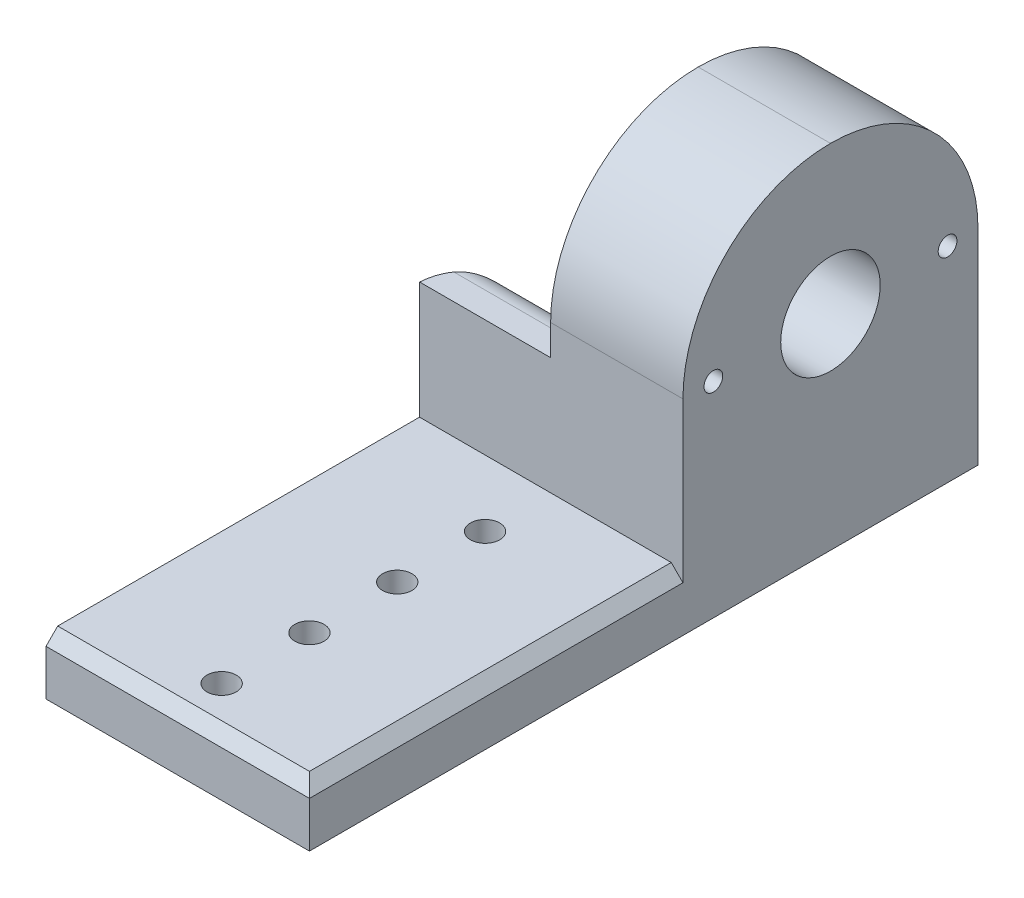
ISO-10303-21;
HEADER;
FILE_DESCRIPTION(('STEP AP214'),'2;1');
FILE_NAME('part.step','',(''),(''),'','','');
FILE_SCHEMA(('AUTOMOTIVE_DESIGN { 1 0 10303 214 1 1 1 1 }'));
ENDSEC;
DATA;
#1=APPLICATION_CONTEXT('core data for automotive mechanical design processes');
#2=APPLICATION_PROTOCOL_DEFINITION('international standard','automotive_design',2000,#1);
#3=PRODUCT_CONTEXT('',#1,'mechanical');
#4=PRODUCT('Part','Part','',(#3));
#5=PRODUCT_RELATED_PRODUCT_CATEGORY('part','',(#4));
#6=PRODUCT_DEFINITION_FORMATION('','',#4);
#7=PRODUCT_DEFINITION_CONTEXT('part definition',#1,'design');
#8=PRODUCT_DEFINITION('design','',#6,#7);
#9=PRODUCT_DEFINITION_SHAPE('','',#8);
#10=(LENGTH_UNIT() NAMED_UNIT(*) SI_UNIT(.MILLI.,.METRE.));
#11=(NAMED_UNIT(*) PLANE_ANGLE_UNIT() SI_UNIT($,.RADIAN.));
#12=(NAMED_UNIT(*) SI_UNIT($,.STERADIAN.) SOLID_ANGLE_UNIT());
#13=UNCERTAINTY_MEASURE_WITH_UNIT(LENGTH_MEASURE(1.E-05),#10,'distance_accuracy_value','');
#14=(GEOMETRIC_REPRESENTATION_CONTEXT(3) GLOBAL_UNCERTAINTY_ASSIGNED_CONTEXT((#13)) GLOBAL_UNIT_ASSIGNED_CONTEXT((#10,
#11,#12)) REPRESENTATION_CONTEXT('',''));
#15=CARTESIAN_POINT('',(0.,0.,0.));
#16=DIRECTION('',(0.,0.,1.));
#17=DIRECTION('',(1.,0.,0.));
#18=AXIS2_PLACEMENT_3D('',#15,#16,#17);
#19=CARTESIAN_POINT('',(28.448,76.454,-81.026));
#20=DIRECTION('',(-1.,0.,0.));
#21=DIRECTION('',(0.,0.,1.));
#22=AXIS2_PLACEMENT_3D('',#19,#20,#21);
#23=PLANE('',#22);
#24=CARTESIAN_POINT('',(28.448,44.45,-87.63));
#25=DIRECTION('',(-1.,0.,0.));
#26=DIRECTION('',(0.,0.,1.));
#27=AXIS2_PLACEMENT_3D('',#24,#25,#26);
#28=CIRCLE('',#27,2.03199999999999);
#29=CARTESIAN_POINT('',(28.448,44.45,-85.598));
#30=VERTEX_POINT('',#29);
#31=EDGE_CURVE('E195',#30,#30,#28,.T.);
#32=ORIENTED_EDGE('',*,*,#31,.F.);
#33=EDGE_LOOP('',(#32));
#34=FACE_BOUND('',#33,.T.);
#35=CARTESIAN_POINT('',(28.448,44.45,-138.43));
#36=DIRECTION('',(-1.,0.,0.));
#37=DIRECTION('',(0.,0.,1.));
#38=AXIS2_PLACEMENT_3D('',#35,#36,#37);
#39=CIRCLE('',#38,2.03200000000001);
#40=CARTESIAN_POINT('',(28.448,44.45,-136.398));
#41=VERTEX_POINT('',#40);
#42=EDGE_CURVE('E201',#41,#41,#39,.T.);
#43=ORIENTED_EDGE('',*,*,#42,.F.);
#44=EDGE_LOOP('',(#43));
#45=FACE_BOUND('',#44,.T.);
#46=CARTESIAN_POINT('',(28.448,44.45,-113.03));
#47=DIRECTION('',(-1.,0.,0.));
#48=DIRECTION('',(0.,0.,1.));
#49=AXIS2_PLACEMENT_3D('',#46,#47,#48);
#50=CIRCLE('',#49,10.795);
#51=CARTESIAN_POINT('',(28.448,44.45,-102.235));
#52=VERTEX_POINT('',#51);
#53=EDGE_CURVE('E207',#52,#52,#50,.T.);
#54=ORIENTED_EDGE('',*,*,#53,.F.);
#55=EDGE_LOOP('',(#54));
#56=FACE_BOUND('',#55,.T.);
#57=DIRECTION('',(0.,-0.707106781186549,-0.707106781186546));
#58=VECTOR('',#57,1.);
#59=CARTESIAN_POINT('',(28.448,13.462,-113.637411412341));
#60=LINE('',#59,#58);
#61=CARTESIAN_POINT('',(28.448,35.9861280605346,-91.1132833518065));
#62=VERTEX_POINT('',#61);
#63=CARTESIAN_POINT('',(28.448,13.462,-113.637411412341));
#64=VERTEX_POINT('',#63);
#65=EDGE_CURVE('E311',#62,#64,#60,.T.);
#66=ORIENTED_EDGE('',*,*,#65,.F.);
#67=CARTESIAN_POINT('',(28.448,31.496,-86.6231552912719));
#68=DIRECTION('',(-1.,0.,0.));
#69=DIRECTION('',(0.,0.,1.));
#70=AXIS2_PLACEMENT_3D('',#67,#68,#69);
#71=CIRCLE('',#70,6.35);
#72=CARTESIAN_POINT('',(28.448,37.846,-86.6231552912719));
#73=VERTEX_POINT('',#72);
#74=EDGE_CURVE('E42',#62,#73,#71,.F.);
#75=ORIENTED_EDGE('',*,*,#74,.T.);
#76=DIRECTION('',(0.,0.,-1.));
#77=VECTOR('',#76,1.);
#78=CARTESIAN_POINT('',(28.448,37.846,-81.026));
#79=LINE('',#78,#77);
#80=CARTESIAN_POINT('',(28.448,37.846,-81.026));
#81=VERTEX_POINT('',#80);
#82=EDGE_CURVE('E326',#81,#73,#79,.T.);
#83=ORIENTED_EDGE('',*,*,#82,.F.);
#84=DIRECTION('',(0.,-1.,0.));
#85=VECTOR('',#84,1.);
#86=CARTESIAN_POINT('',(28.448,76.454,-81.026));
#87=LINE('',#86,#85);
#88=CARTESIAN_POINT('',(28.448,44.45,-81.026));
#89=VERTEX_POINT('',#88);
#90=EDGE_CURVE('E218',#89,#81,#87,.T.);
#91=ORIENTED_EDGE('',*,*,#90,.F.);
#92=CARTESIAN_POINT('',(28.448,44.45,-113.03));
#93=DIRECTION('',(-1.,0.,0.));
#94=DIRECTION('',(0.,0.,1.));
#95=AXIS2_PLACEMENT_3D('',#92,#93,#94);
#96=CIRCLE('',#95,32.004);
#97=CARTESIAN_POINT('',(28.448,76.454,-113.03));
#98=VERTEX_POINT('',#97);
#99=EDGE_CURVE('E261',#89,#98,#96,.T.);
#100=ORIENTED_EDGE('',*,*,#99,.T.);
#101=CARTESIAN_POINT('',(28.448,44.45,-113.03));
#102=DIRECTION('',(-1.,0.,0.));
#103=DIRECTION('',(0.,0.,1.));
#104=AXIS2_PLACEMENT_3D('',#101,#102,#103);
#105=CIRCLE('',#104,32.004);
#106=CARTESIAN_POINT('',(28.448,44.45,-145.034));
#107=VERTEX_POINT('',#106);
#108=EDGE_CURVE('E263',#98,#107,#105,.T.);
#109=ORIENTED_EDGE('',*,*,#108,.T.);
#110=DIRECTION('',(0.,-1.,0.));
#111=VECTOR('',#110,1.);
#112=CARTESIAN_POINT('',(28.448,76.454,-145.034));
#113=LINE('',#112,#111);
#114=CARTESIAN_POINT('',(28.448,37.846,-145.034));
#115=VERTEX_POINT('',#114);
#116=EDGE_CURVE('E214',#107,#115,#113,.T.);
#117=ORIENTED_EDGE('',*,*,#116,.T.);
#118=DIRECTION('',(0.,0.,-1.));
#119=VECTOR('',#118,1.);
#120=CARTESIAN_POINT('',(28.448,37.846,-138.021411412341));
#121=LINE('',#120,#119);
#122=CARTESIAN_POINT('',(28.448,37.846,-140.65166753341));
#123=VERTEX_POINT('',#122);
#124=EDGE_CURVE('E322',#123,#115,#121,.T.);
#125=ORIENTED_EDGE('',*,*,#124,.F.);
#126=CARTESIAN_POINT('',(28.448,31.496,-140.65166753341));
#127=DIRECTION('',(-1.,0.,0.));
#128=DIRECTION('',(0.,0.,1.));
#129=AXIS2_PLACEMENT_3D('',#126,#127,#128);
#130=CIRCLE('',#129,6.35);
#131=CARTESIAN_POINT('',(28.448,35.9861280605346,-136.161539472876));
#132=VERTEX_POINT('',#131);
#133=EDGE_CURVE('E11',#123,#132,#130,.F.);
#134=ORIENTED_EDGE('',*,*,#133,.T.);
#135=DIRECTION('',(0.,0.707106781186544,-0.707106781186551));
#136=VECTOR('',#135,1.);
#137=CARTESIAN_POINT('',(28.448,13.462,-113.637411412341));
#138=LINE('',#137,#136);
#139=EDGE_CURVE('E315',#64,#132,#138,.T.);
#140=ORIENTED_EDGE('',*,*,#139,.F.);
#141=EDGE_LOOP('',(#66,#75,#83,#91,#100,#109,#117,#125,#134,#140));
#142=FACE_BOUND('',#141,.T.);
#143=ADVANCED_FACE('F33',(#34,#45,#56,#142),#23,.T.);
#144=CARTESIAN_POINT('',(0.,12.446,0.));
#145=DIRECTION('',(0.,-1.,0.));
#146=DIRECTION('',(0.,0.,-1.));
#147=AXIS2_PLACEMENT_3D('',#144,#145,#146);
#148=PLANE('',#147);
#149=CARTESIAN_POINT('',(28.575,12.446,-9.525));
#150=DIRECTION('',(0.,-1.,0.));
#151=DIRECTION('',(0.,0.,-1.));
#152=AXIS2_PLACEMENT_3D('',#149,#150,#151);
#153=CIRCLE('',#152,3.175);
#154=CARTESIAN_POINT('',(28.575,12.446,-12.7));
#155=VERTEX_POINT('',#154);
#156=EDGE_CURVE('E192',#155,#155,#153,.F.);
#157=ORIENTED_EDGE('',*,*,#156,.F.);
#158=EDGE_LOOP('',(#157));
#159=FACE_BOUND('',#158,.T.);
#160=CARTESIAN_POINT('',(28.575,12.446,-47.625));
#161=DIRECTION('',(0.,-1.,0.));
#162=DIRECTION('',(0.,0.,-1.));
#163=AXIS2_PLACEMENT_3D('',#160,#161,#162);
#164=CIRCLE('',#163,3.175);
#165=CARTESIAN_POINT('',(28.575,12.446,-50.8));
#166=VERTEX_POINT('',#165);
#167=EDGE_CURVE('E186',#166,#166,#164,.F.);
#168=ORIENTED_EDGE('',*,*,#167,.F.);
#169=EDGE_LOOP('',(#168));
#170=FACE_BOUND('',#169,.T.);
#171=CARTESIAN_POINT('',(28.575,12.446,-66.675));
#172=DIRECTION('',(0.,-1.,0.));
#173=DIRECTION('',(0.,0.,-1.));
#174=AXIS2_PLACEMENT_3D('',#171,#172,#173);
#175=CIRCLE('',#174,3.175);
#176=CARTESIAN_POINT('',(28.575,12.446,-69.85));
#177=VERTEX_POINT('',#176);
#178=EDGE_CURVE('E174',#177,#177,#175,.F.);
#179=ORIENTED_EDGE('',*,*,#178,.F.);
#180=EDGE_LOOP('',(#179));
#181=FACE_BOUND('',#180,.T.);
#182=CARTESIAN_POINT('',(28.575,12.446,-28.575));
#183=DIRECTION('',(0.,-1.,0.));
#184=DIRECTION('',(0.,0.,-1.));
#185=AXIS2_PLACEMENT_3D('',#182,#183,#184);
#186=CIRCLE('',#185,3.175);
#187=CARTESIAN_POINT('',(28.575,12.446,-31.75));
#188=VERTEX_POINT('',#187);
#189=EDGE_CURVE('E189',#188,#188,#186,.F.);
#190=ORIENTED_EDGE('',*,*,#189,.F.);
#191=EDGE_LOOP('',(#190));
#192=FACE_BOUND('',#191,.T.);
#193=DIRECTION('',(-1.,0.,0.));
#194=VECTOR('',#193,1.);
#195=CARTESIAN_POINT('',(57.15,12.446,-81.026));
#196=LINE('',#195,#194);
#197=CARTESIAN_POINT('',(54.6099999999999,12.446,-81.026));
#198=VERTEX_POINT('',#197);
#199=CARTESIAN_POINT('',(0.,12.446,-81.026));
#200=VERTEX_POINT('',#199);
#201=EDGE_CURVE('E157',#198,#200,#196,.T.);
#202=ORIENTED_EDGE('',*,*,#201,.T.);
#203=DIRECTION('',(0.,0.,1.));
#204=VECTOR('',#203,1.);
#205=CARTESIAN_POINT('',(0.,12.446,-145.034));
#206=LINE('',#205,#204);
#207=CARTESIAN_POINT('',(0.,12.446,-2.54000000000008));
#208=VERTEX_POINT('',#207);
#209=EDGE_CURVE('E170',#200,#208,#206,.T.);
#210=ORIENTED_EDGE('',*,*,#209,.T.);
#211=DIRECTION('',(1.,0.,0.));
#212=VECTOR('',#211,1.);
#213=CARTESIAN_POINT('',(0.,12.446,-2.54000000000004));
#214=LINE('',#213,#212);
#215=CARTESIAN_POINT('',(54.61,12.446,-2.54000000000004));
#216=VERTEX_POINT('',#215);
#217=EDGE_CURVE('E272',#208,#216,#214,.T.);
#218=ORIENTED_EDGE('',*,*,#217,.T.);
#219=DIRECTION('',(0.,0.,-1.));
#220=VECTOR('',#219,1.);
#221=CARTESIAN_POINT('',(54.61,12.446,0.));
#222=LINE('',#221,#220);
#223=EDGE_CURVE('E173',#216,#198,#222,.T.);
#224=ORIENTED_EDGE('',*,*,#223,.T.);
#225=EDGE_LOOP('',(#202,#210,#218,#224));
#226=FACE_BOUND('',#225,.T.);
#227=ADVANCED_FACE('F168',(#159,#170,#181,#192,#226),#148,.F.);
#228=CARTESIAN_POINT('',(0.,25.4,0.));
#229=DIRECTION('',(1.,0.,0.));
#230=DIRECTION('',(0.,0.,-1.));
#231=AXIS2_PLACEMENT_3D('',#228,#229,#230);
#232=PLANE('',#231);
#233=DIRECTION('',(0.,-1.,0.));
#234=VECTOR('',#233,1.);
#235=CARTESIAN_POINT('',(0.,12.446,-81.026));
#236=LINE('',#235,#234);
#237=CARTESIAN_POINT('',(0.,37.0931552912719,-81.026));
#238=VERTEX_POINT('',#237);
#239=EDGE_CURVE('E152',#238,#200,#236,.T.);
#240=ORIENTED_EDGE('',*,*,#239,.F.);
#241=DIRECTION('',(0.,0.707106781186549,0.707106781186546));
#242=VECTOR('',#241,1.);
#243=CARTESIAN_POINT('',(0.,71.759577645636,-46.3595776456362));
#244=LINE('',#243,#242);
#245=CARTESIAN_POINT('',(0.,4.48174387893086,-113.637411412341));
#246=VERTEX_POINT('',#245);
#247=EDGE_CURVE('E293',#238,#246,#244,.F.);
#248=ORIENTED_EDGE('',*,*,#247,.T.);
#249=DIRECTION('',(0.,-0.707106781186544,0.707106781186551));
#250=VECTOR('',#249,1.);
#251=CARTESIAN_POINT('',(0.,-41.8778337667052,-67.2778337667044));
#252=LINE('',#251,#250);
#253=CARTESIAN_POINT('',(0.,35.8783324665896,-145.034));
#254=VERTEX_POINT('',#253);
#255=EDGE_CURVE('E291',#246,#254,#252,.F.);
#256=ORIENTED_EDGE('',*,*,#255,.T.);
#257=DIRECTION('',(0.,-1.,0.));
#258=VECTOR('',#257,1.);
#259=CARTESIAN_POINT('',(0.,25.4,-145.034));
#260=LINE('',#259,#258);
#261=CARTESIAN_POINT('',(0.,0.,-145.034));
#262=VERTEX_POINT('',#261);
#263=EDGE_CURVE('E246',#254,#262,#260,.T.);
#264=ORIENTED_EDGE('',*,*,#263,.T.);
#265=DIRECTION('',(0.,0.,1.));
#266=VECTOR('',#265,1.);
#267=CARTESIAN_POINT('',(0.,0.,0.));
#268=LINE('',#267,#266);
#269=CARTESIAN_POINT('',(0.,0.,0.));
#270=VERTEX_POINT('',#269);
#271=EDGE_CURVE('E234',#262,#270,#268,.T.);
#272=ORIENTED_EDGE('',*,*,#271,.T.);
#273=DIRECTION('',(0.,-1.,0.));
#274=VECTOR('',#273,1.);
#275=CARTESIAN_POINT('',(0.,25.4,0.));
#276=LINE('',#275,#274);
#277=CARTESIAN_POINT('',(0.,9.90599999999996,0.));
#278=VERTEX_POINT('',#277);
#279=EDGE_CURVE('E252',#278,#270,#276,.T.);
#280=ORIENTED_EDGE('',*,*,#279,.F.);
#281=DIRECTION('',(0.,-0.707106781186548,0.707106781186548));
#282=VECTOR('',#281,1.);
#283=CARTESIAN_POINT('',(0.,12.446,-2.54000000000004));
#284=LINE('',#283,#282);
#285=EDGE_CURVE('E179',#278,#208,#284,.F.);
#286=ORIENTED_EDGE('',*,*,#285,.T.);
#287=ORIENTED_EDGE('',*,*,#209,.F.);
#288=EDGE_LOOP('',(#240,#248,#256,#264,#272,#280,#286,#287));
#289=FACE_BOUND('',#288,.T.);
#290=ADVANCED_FACE('F176',(#289),#232,.F.);
#291=CARTESIAN_POINT('',(0.,25.4,0.));
#292=DIRECTION('',(0.,0.,-1.));
#293=DIRECTION('',(-1.,0.,0.));
#294=AXIS2_PLACEMENT_3D('',#291,#292,#293);
#295=PLANE('',#294);
#296=DIRECTION('',(0.,-1.,0.));
#297=VECTOR('',#296,1.);
#298=CARTESIAN_POINT('',(57.15,25.4,0.));
#299=LINE('',#298,#297);
#300=CARTESIAN_POINT('',(57.15,9.90599999999996,0.));
#301=VERTEX_POINT('',#300);
#302=CARTESIAN_POINT('',(57.15,0.,0.));
#303=VERTEX_POINT('',#302);
#304=EDGE_CURVE('E250',#301,#303,#299,.T.);
#305=ORIENTED_EDGE('',*,*,#304,.F.);
#306=DIRECTION('',(-1.,0.,0.));
#307=VECTOR('',#306,1.);
#308=CARTESIAN_POINT('',(0.,9.90599999999996,0.));
#309=LINE('',#308,#307);
#310=EDGE_CURVE('E274',#301,#278,#309,.T.);
#311=ORIENTED_EDGE('',*,*,#310,.T.);
#312=ORIENTED_EDGE('',*,*,#279,.T.);
#313=DIRECTION('',(1.,0.,0.));
#314=VECTOR('',#313,1.);
#315=CARTESIAN_POINT('',(0.,0.,0.));
#316=LINE('',#315,#314);
#317=EDGE_CURVE('E237',#270,#303,#316,.T.);
#318=ORIENTED_EDGE('',*,*,#317,.T.);
#319=EDGE_LOOP('',(#305,#311,#312,#318));
#320=FACE_BOUND('',#319,.T.);
#321=ADVANCED_FACE('F389',(#320),#295,.F.);
#322=CARTESIAN_POINT('',(57.15,25.4,0.));
#323=DIRECTION('',(-1.,0.,0.));
#324=DIRECTION('',(0.,0.,1.));
#325=AXIS2_PLACEMENT_3D('',#322,#323,#324);
#326=PLANE('',#325);
#327=CARTESIAN_POINT('',(57.15,44.45,-87.63));
#328=DIRECTION('',(-1.,0.,0.));
#329=DIRECTION('',(0.,0.,1.));
#330=AXIS2_PLACEMENT_3D('',#327,#328,#329);
#331=CIRCLE('',#330,2.03199999999999);
#332=CARTESIAN_POINT('',(57.15,44.45,-85.598));
#333=VERTEX_POINT('',#332);
#334=EDGE_CURVE('E198',#333,#333,#331,.T.);
#335=ORIENTED_EDGE('',*,*,#334,.T.);
#336=EDGE_LOOP('',(#335));
#337=FACE_BOUND('',#336,.T.);
#338=CARTESIAN_POINT('',(57.15,44.45,-138.43));
#339=DIRECTION('',(-1.,0.,0.));
#340=DIRECTION('',(0.,0.,1.));
#341=AXIS2_PLACEMENT_3D('',#338,#339,#340);
#342=CIRCLE('',#341,2.03200000000001);
#343=CARTESIAN_POINT('',(57.15,44.45,-136.398));
#344=VERTEX_POINT('',#343);
#345=EDGE_CURVE('E204',#344,#344,#342,.T.);
#346=ORIENTED_EDGE('',*,*,#345,.T.);
#347=EDGE_LOOP('',(#346));
#348=FACE_BOUND('',#347,.T.);
#349=CARTESIAN_POINT('',(57.15,44.45,-113.03));
#350=DIRECTION('',(-1.,0.,0.));
#351=DIRECTION('',(0.,0.,1.));
#352=AXIS2_PLACEMENT_3D('',#349,#350,#351);
#353=CIRCLE('',#352,10.795);
#354=CARTESIAN_POINT('',(57.15,44.45,-102.235));
#355=VERTEX_POINT('',#354);
#356=EDGE_CURVE('E210',#355,#355,#353,.T.);
#357=ORIENTED_EDGE('',*,*,#356,.T.);
#358=EDGE_LOOP('',(#357));
#359=FACE_BOUND('',#358,.T.);
#360=DIRECTION('',(0.,-1.,0.));
#361=VECTOR('',#360,1.);
#362=CARTESIAN_POINT('',(57.15,76.454,-81.026));
#363=LINE('',#362,#361);
#364=CARTESIAN_POINT('',(57.15,44.45,-81.026));
#365=VERTEX_POINT('',#364);
#366=CARTESIAN_POINT('',(57.15,9.90599999999996,-81.026));
#367=VERTEX_POINT('',#366);
#368=EDGE_CURVE('E221',#365,#367,#363,.T.);
#369=ORIENTED_EDGE('',*,*,#368,.T.);
#370=DIRECTION('',(0.,0.,1.));
#371=VECTOR('',#370,1.);
#372=CARTESIAN_POINT('',(57.15,9.90599999999996,0.));
#373=LINE('',#372,#371);
#374=EDGE_CURVE('E277',#367,#301,#373,.T.);
#375=ORIENTED_EDGE('',*,*,#374,.T.);
#376=ORIENTED_EDGE('',*,*,#304,.T.);
#377=DIRECTION('',(0.,0.,-1.));
#378=VECTOR('',#377,1.);
#379=CARTESIAN_POINT('',(57.15,0.,0.));
#380=LINE('',#379,#378);
#381=CARTESIAN_POINT('',(57.15,0.,-145.034));
#382=VERTEX_POINT('',#381);
#383=EDGE_CURVE('E240',#303,#382,#380,.T.);
#384=ORIENTED_EDGE('',*,*,#383,.T.);
#385=DIRECTION('',(0.,-1.,0.));
#386=VECTOR('',#385,1.);
#387=CARTESIAN_POINT('',(57.15,25.4,-145.034));
#388=LINE('',#387,#386);
#389=CARTESIAN_POINT('',(57.15,44.45,-145.034));
#390=VERTEX_POINT('',#389);
#391=EDGE_CURVE('E248',#390,#382,#388,.T.);
#392=ORIENTED_EDGE('',*,*,#391,.F.);
#393=CARTESIAN_POINT('',(57.15,44.45,-113.03));
#394=DIRECTION('',(-1.,0.,0.));
#395=DIRECTION('',(0.,0.,1.));
#396=AXIS2_PLACEMENT_3D('',#393,#394,#395);
#397=CIRCLE('',#396,32.004);
#398=CARTESIAN_POINT('',(57.15,76.454,-113.03));
#399=VERTEX_POINT('',#398);
#400=EDGE_CURVE('E259',#390,#399,#397,.F.);
#401=ORIENTED_EDGE('',*,*,#400,.T.);
#402=CARTESIAN_POINT('',(57.15,44.45,-113.03));
#403=DIRECTION('',(-1.,0.,0.));
#404=DIRECTION('',(0.,0.,1.));
#405=AXIS2_PLACEMENT_3D('',#402,#403,#404);
#406=CIRCLE('',#405,32.004);
#407=EDGE_CURVE('E257',#399,#365,#406,.F.);
#408=ORIENTED_EDGE('',*,*,#407,.T.);
#409=EDGE_LOOP('',(#369,#375,#376,#384,#392,#401,#408));
#410=FACE_BOUND('',#409,.T.);
#411=ADVANCED_FACE('F387',(#337,#348,#359,#410),#326,.F.);
#412=CARTESIAN_POINT('',(0.,25.4,-145.034));
#413=DIRECTION('',(0.,0.,1.));
#414=DIRECTION('',(1.,0.,0.));
#415=AXIS2_PLACEMENT_3D('',#412,#413,#414);
#416=PLANE('',#415);
#417=ORIENTED_EDGE('',*,*,#263,.F.);
#418=CARTESIAN_POINT('',(6.34999999999998,35.8783324665896,-145.034));
#419=DIRECTION('',(0.,0.,1.));
#420=DIRECTION('',(0.,-1.,0.));
#421=AXIS2_PLACEMENT_3D('',#418,#419,#420);
#422=ELLIPSE('',#421,8.9802561210691,6.35);
#423=CARTESIAN_POINT('',(0.154304539522504,37.846,-145.034));
#424=VERTEX_POINT('',#423);
#425=EDGE_CURVE('E299',#254,#424,#422,.F.);
#426=ORIENTED_EDGE('',*,*,#425,.T.);
#427=DIRECTION('',(1.,0.,0.));
#428=VECTOR('',#427,1.);
#429=CARTESIAN_POINT('',(-68.8635176563033,37.846,-145.034));
#430=LINE('',#429,#428);
#431=EDGE_CURVE('E330',#424,#115,#430,.T.);
#432=ORIENTED_EDGE('',*,*,#431,.T.);
#433=ORIENTED_EDGE('',*,*,#116,.F.);
#434=DIRECTION('',(1.,0.,0.));
#435=VECTOR('',#434,1.);
#436=CARTESIAN_POINT('',(57.15,44.45,-145.034));
#437=LINE('',#436,#435);
#438=EDGE_CURVE('E254',#107,#390,#437,.T.);
#439=ORIENTED_EDGE('',*,*,#438,.T.);
#440=ORIENTED_EDGE('',*,*,#391,.T.);
#441=DIRECTION('',(-1.,0.,0.));
#442=VECTOR('',#441,1.);
#443=CARTESIAN_POINT('',(0.,0.,-145.034));
#444=LINE('',#443,#442);
#445=EDGE_CURVE('E243',#382,#262,#444,.T.);
#446=ORIENTED_EDGE('',*,*,#445,.T.);
#447=EDGE_LOOP('',(#417,#426,#432,#433,#439,#440,#446));
#448=FACE_BOUND('',#447,.T.);
#449=ADVANCED_FACE('F358',(#448),#416,.F.);
#450=CARTESIAN_POINT('',(0.,0.,0.));
#451=DIRECTION('',(0.,-1.,0.));
#452=DIRECTION('',(0.,0.,-1.));
#453=AXIS2_PLACEMENT_3D('',#450,#451,#452);
#454=PLANE('',#453);
#455=ORIENTED_EDGE('',*,*,#271,.F.);
#456=ORIENTED_EDGE('',*,*,#445,.F.);
#457=ORIENTED_EDGE('',*,*,#383,.F.);
#458=ORIENTED_EDGE('',*,*,#317,.F.);
#459=EDGE_LOOP('',(#455,#456,#457,#458));
#460=FACE_BOUND('',#459,.T.);
#461=CARTESIAN_POINT('',(28.575,0.,-66.675));
#462=DIRECTION('',(0.,-1.,0.));
#463=DIRECTION('',(0.,0.,-1.));
#464=AXIS2_PLACEMENT_3D('',#461,#462,#463);
#465=CIRCLE('',#464,3.175);
#466=CARTESIAN_POINT('',(28.575,0.,-69.85));
#467=VERTEX_POINT('',#466);
#468=EDGE_CURVE('E217',#467,#467,#465,.T.);
#469=ORIENTED_EDGE('',*,*,#468,.F.);
#470=EDGE_LOOP('',(#469));
#471=FACE_BOUND('',#470,.T.);
#472=CARTESIAN_POINT('',(28.575,0.,-47.625));
#473=DIRECTION('',(0.,-1.,0.));
#474=DIRECTION('',(0.,0.,-1.));
#475=AXIS2_PLACEMENT_3D('',#472,#473,#474);
#476=CIRCLE('',#475,3.175);
#477=CARTESIAN_POINT('',(28.575,0.,-50.8));
#478=VERTEX_POINT('',#477);
#479=EDGE_CURVE('E225',#478,#478,#476,.T.);
#480=ORIENTED_EDGE('',*,*,#479,.F.);
#481=EDGE_LOOP('',(#480));
#482=FACE_BOUND('',#481,.T.);
#483=CARTESIAN_POINT('',(28.575,0.,-28.575));
#484=DIRECTION('',(0.,-1.,0.));
#485=DIRECTION('',(0.,0.,-1.));
#486=AXIS2_PLACEMENT_3D('',#483,#484,#485);
#487=CIRCLE('',#486,3.175);
#488=CARTESIAN_POINT('',(28.575,0.,-31.75));
#489=VERTEX_POINT('',#488);
#490=EDGE_CURVE('E228',#489,#489,#487,.T.);
#491=ORIENTED_EDGE('',*,*,#490,.F.);
#492=EDGE_LOOP('',(#491));
#493=FACE_BOUND('',#492,.T.);
#494=CARTESIAN_POINT('',(28.575,0.,-9.525));
#495=DIRECTION('',(0.,-1.,0.));
#496=DIRECTION('',(0.,0.,-1.));
#497=AXIS2_PLACEMENT_3D('',#494,#495,#496);
#498=CIRCLE('',#497,3.175);
#499=CARTESIAN_POINT('',(28.575,0.,-12.7));
#500=VERTEX_POINT('',#499);
#501=EDGE_CURVE('E231',#500,#500,#498,.T.);
#502=ORIENTED_EDGE('',*,*,#501,.F.);
#503=EDGE_LOOP('',(#502));
#504=FACE_BOUND('',#503,.T.);
#505=ADVANCED_FACE('F365',(#460,#471,#482,#493,#504),#454,.T.);
#506=CARTESIAN_POINT('',(28.575,25.4,-9.525));
#507=DIRECTION('',(0.,-1.,0.));
#508=DIRECTION('',(0.,0.,-1.));
#509=AXIS2_PLACEMENT_3D('',#506,#507,#508);
#510=CYLINDRICAL_SURFACE('',#509,3.175);
#511=ORIENTED_EDGE('',*,*,#156,.T.);
#512=EDGE_LOOP('',(#511));
#513=FACE_BOUND('',#512,.T.);
#514=ORIENTED_EDGE('',*,*,#501,.T.);
#515=EDGE_LOOP('',(#514));
#516=FACE_BOUND('',#515,.T.);
#517=ADVANCED_FACE('F426',(#513,#516),#510,.F.);
#518=CARTESIAN_POINT('',(28.575,25.4,-28.575));
#519=DIRECTION('',(0.,-1.,0.));
#520=DIRECTION('',(0.,0.,-1.));
#521=AXIS2_PLACEMENT_3D('',#518,#519,#520);
#522=CYLINDRICAL_SURFACE('',#521,3.175);
#523=ORIENTED_EDGE('',*,*,#189,.T.);
#524=EDGE_LOOP('',(#523));
#525=FACE_BOUND('',#524,.T.);
#526=ORIENTED_EDGE('',*,*,#490,.T.);
#527=EDGE_LOOP('',(#526));
#528=FACE_BOUND('',#527,.T.);
#529=ADVANCED_FACE('F422',(#525,#528),#522,.F.);
#530=CARTESIAN_POINT('',(28.575,25.4,-47.625));
#531=DIRECTION('',(0.,-1.,0.));
#532=DIRECTION('',(0.,0.,-1.));
#533=AXIS2_PLACEMENT_3D('',#530,#531,#532);
#534=CYLINDRICAL_SURFACE('',#533,3.175);
#535=ORIENTED_EDGE('',*,*,#167,.T.);
#536=EDGE_LOOP('',(#535));
#537=FACE_BOUND('',#536,.T.);
#538=ORIENTED_EDGE('',*,*,#479,.T.);
#539=EDGE_LOOP('',(#538));
#540=FACE_BOUND('',#539,.T.);
#541=ADVANCED_FACE('F418',(#537,#540),#534,.F.);
#542=CARTESIAN_POINT('',(28.575,25.4,-66.675));
#543=DIRECTION('',(0.,-1.,0.));
#544=DIRECTION('',(0.,0.,-1.));
#545=AXIS2_PLACEMENT_3D('',#542,#543,#544);
#546=CYLINDRICAL_SURFACE('',#545,3.175);
#547=ORIENTED_EDGE('',*,*,#178,.T.);
#548=EDGE_LOOP('',(#547));
#549=FACE_BOUND('',#548,.T.);
#550=ORIENTED_EDGE('',*,*,#468,.T.);
#551=EDGE_LOOP('',(#550));
#552=FACE_BOUND('',#551,.T.);
#553=ADVANCED_FACE('F415',(#549,#552),#546,.F.);
#554=CARTESIAN_POINT('',(57.15,76.454,-81.026));
#555=DIRECTION('',(0.,0.,1.));
#556=DIRECTION('',(1.,0.,0.));
#557=AXIS2_PLACEMENT_3D('',#554,#555,#556);
#558=PLANE('',#557);
#559=DIRECTION('',(1.,0.,0.));
#560=VECTOR('',#559,1.);
#561=CARTESIAN_POINT('',(-68.8635176563033,37.846,-81.026));
#562=LINE('',#561,#560);
#563=CARTESIAN_POINT('',(0.0223533266884846,37.846,-81.026));
#564=VERTEX_POINT('',#563);
#565=EDGE_CURVE('E329',#564,#81,#562,.T.);
#566=ORIENTED_EDGE('',*,*,#565,.F.);
#567=CARTESIAN_POINT('',(6.34999999999999,37.0931552912719,-81.026));
#568=DIRECTION('',(0.,0.,1.));
#569=DIRECTION('',(0.,1.,0.));
#570=AXIS2_PLACEMENT_3D('',#567,#568,#569);
#571=ELLIPSE('',#570,8.98025612106917,6.35);
#572=EDGE_CURVE('E160',#564,#238,#571,.T.);
#573=ORIENTED_EDGE('',*,*,#572,.T.);
#574=ORIENTED_EDGE('',*,*,#239,.T.);
#575=ORIENTED_EDGE('',*,*,#201,.F.);
#576=DIRECTION('',(-0.707106781186548,0.707106781186548,0.));
#577=VECTOR('',#576,1.);
#578=CARTESIAN_POINT('',(54.6099999999999,12.446,-81.026));
#579=LINE('',#578,#577);
#580=EDGE_CURVE('E279',#198,#367,#579,.F.);
#581=ORIENTED_EDGE('',*,*,#580,.T.);
#582=ORIENTED_EDGE('',*,*,#368,.F.);
#583=DIRECTION('',(-1.,0.,0.));
#584=VECTOR('',#583,1.);
#585=CARTESIAN_POINT('',(57.15,44.45,-81.026));
#586=LINE('',#585,#584);
#587=EDGE_CURVE('E265',#365,#89,#586,.T.);
#588=ORIENTED_EDGE('',*,*,#587,.T.);
#589=ORIENTED_EDGE('',*,*,#90,.T.);
#590=EDGE_LOOP('',(#566,#573,#574,#575,#581,#582,#588,#589));
#591=FACE_BOUND('',#590,.T.);
#592=ADVANCED_FACE('F155',(#591),#558,.T.);
#593=CARTESIAN_POINT('',(57.15,44.45,-113.03));
#594=DIRECTION('',(-1.,0.,0.));
#595=DIRECTION('',(0.,0.,1.));
#596=AXIS2_PLACEMENT_3D('',#593,#594,#595);
#597=CYLINDRICAL_SURFACE('',#596,32.004);
#598=DIRECTION('',(-1.,0.,0.));
#599=VECTOR('',#598,1.);
#600=CARTESIAN_POINT('',(0.,76.454,-113.03));
#601=LINE('',#600,#599);
#602=EDGE_CURVE('E213',#98,#399,#601,.F.);
#603=ORIENTED_EDGE('',*,*,#602,.F.);
#604=ORIENTED_EDGE('',*,*,#99,.F.);
#605=ORIENTED_EDGE('',*,*,#587,.F.);
#606=ORIENTED_EDGE('',*,*,#407,.F.);
#607=EDGE_LOOP('',(#603,#604,#605,#606));
#608=FACE_BOUND('',#607,.T.);
#609=ADVANCED_FACE('F382',(#608),#597,.T.);
#610=CARTESIAN_POINT('',(0.,44.45,-113.03));
#611=DIRECTION('',(-1.,0.,0.));
#612=DIRECTION('',(0.,0.,1.));
#613=AXIS2_PLACEMENT_3D('',#610,#611,#612);
#614=CYLINDRICAL_SURFACE('',#613,32.004);
#615=ORIENTED_EDGE('',*,*,#108,.F.);
#616=ORIENTED_EDGE('',*,*,#602,.T.);
#617=ORIENTED_EDGE('',*,*,#400,.F.);
#618=ORIENTED_EDGE('',*,*,#438,.F.);
#619=EDGE_LOOP('',(#615,#616,#617,#618));
#620=FACE_BOUND('',#619,.T.);
#621=ADVANCED_FACE('F386',(#620),#614,.T.);
#622=CARTESIAN_POINT('',(104.902,44.45,-113.03));
#623=DIRECTION('',(-1.,0.,0.));
#624=DIRECTION('',(0.,0.,1.));
#625=AXIS2_PLACEMENT_3D('',#622,#623,#624);
#626=CYLINDRICAL_SURFACE('',#625,10.795);
#627=ORIENTED_EDGE('',*,*,#53,.T.);
#628=EDGE_LOOP('',(#627));
#629=FACE_BOUND('',#628,.T.);
#630=ORIENTED_EDGE('',*,*,#356,.F.);
#631=EDGE_LOOP('',(#630));
#632=FACE_BOUND('',#631,.T.);
#633=ADVANCED_FACE('F411',(#629,#632),#626,.F.);
#634=CARTESIAN_POINT('',(104.902,44.45,-138.43));
#635=DIRECTION('',(-1.,0.,0.));
#636=DIRECTION('',(0.,0.,1.));
#637=AXIS2_PLACEMENT_3D('',#634,#635,#636);
#638=CYLINDRICAL_SURFACE('',#637,2.03200000000001);
#639=ORIENTED_EDGE('',*,*,#42,.T.);
#640=EDGE_LOOP('',(#639));
#641=FACE_BOUND('',#640,.T.);
#642=ORIENTED_EDGE('',*,*,#345,.F.);
#643=EDGE_LOOP('',(#642));
#644=FACE_BOUND('',#643,.T.);
#645=ADVANCED_FACE('F483',(#641,#644),#638,.F.);
#646=CARTESIAN_POINT('',(104.902,44.45,-87.63));
#647=DIRECTION('',(-1.,0.,0.));
#648=DIRECTION('',(0.,0.,1.));
#649=AXIS2_PLACEMENT_3D('',#646,#647,#648);
#650=CYLINDRICAL_SURFACE('',#649,2.03199999999999);
#651=ORIENTED_EDGE('',*,*,#31,.T.);
#652=EDGE_LOOP('',(#651));
#653=FACE_BOUND('',#652,.T.);
#654=ORIENTED_EDGE('',*,*,#334,.F.);
#655=EDGE_LOOP('',(#654));
#656=FACE_BOUND('',#655,.T.);
#657=ADVANCED_FACE('F490',(#653,#656),#650,.F.);
#658=CARTESIAN_POINT('',(54.61,12.446,0.));
#659=DIRECTION('',(-0.707106781186548,-0.707106781186548,0.));
#660=DIRECTION('',(0.,0.,-1.));
#661=AXIS2_PLACEMENT_3D('',#658,#659,#660);
#662=PLANE('',#661);
#663=ORIENTED_EDGE('',*,*,#580,.F.);
#664=ORIENTED_EDGE('',*,*,#223,.F.);
#665=DIRECTION('',(0.577350269189626,-0.577350269189626,0.577350269189626));
#666=VECTOR('',#665,1.);
#667=CARTESIAN_POINT('',(55.4566666666666,11.5993333333333,-1.69333333333336));
#668=LINE('',#667,#666);
#669=EDGE_CURVE('E164',#301,#216,#668,.F.);
#670=ORIENTED_EDGE('',*,*,#669,.F.);
#671=ORIENTED_EDGE('',*,*,#374,.F.);
#672=EDGE_LOOP('',(#663,#664,#670,#671));
#673=FACE_BOUND('',#672,.T.);
#674=ADVANCED_FACE('F374',(#673),#662,.F.);
#675=CARTESIAN_POINT('',(0.,12.446,-2.54000000000004));
#676=DIRECTION('',(0.,-0.707106781186548,-0.707106781186548));
#677=DIRECTION('',(1.,0.,0.));
#678=AXIS2_PLACEMENT_3D('',#675,#676,#677);
#679=PLANE('',#678);
#680=ORIENTED_EDGE('',*,*,#285,.F.);
#681=ORIENTED_EDGE('',*,*,#310,.F.);
#682=ORIENTED_EDGE('',*,*,#669,.T.);
#683=ORIENTED_EDGE('',*,*,#217,.F.);
#684=EDGE_LOOP('',(#680,#681,#682,#683));
#685=FACE_BOUND('',#684,.T.);
#686=ADVANCED_FACE('F370',(#685),#679,.F.);
#687=CARTESIAN_POINT('',(-68.8635176563033,37.846,-81.026));
#688=DIRECTION('',(0.,-1.,0.));
#689=DIRECTION('',(0.,0.,-1.));
#690=AXIS2_PLACEMENT_3D('',#687,#688,#689);
#691=PLANE('',#690);
#692=DIRECTION('',(1.,0.,0.));
#693=VECTOR('',#692,1.);
#694=CARTESIAN_POINT('',(-68.8635176563033,37.846,-86.6231552912719));
#695=LINE('',#694,#693);
#696=CARTESIAN_POINT('',(1.85987193946539,37.846,-86.6231552912719));
#697=VERTEX_POINT('',#696);
#698=EDGE_CURVE('E286',#73,#697,#695,.F.);
#699=ORIENTED_EDGE('',*,*,#698,.T.);
#700=CARTESIAN_POINT('',(6.34999999999999,37.846,-80.2731552912719));
#701=DIRECTION('',(0.,-1.,0.));
#702=DIRECTION('',(0.,0.,1.));
#703=AXIS2_PLACEMENT_3D('',#700,#701,#702);
#704=ELLIPSE('',#703,8.98025612106913,6.35);
#705=EDGE_CURVE('E288',#697,#564,#704,.F.);
#706=ORIENTED_EDGE('',*,*,#705,.T.);
#707=ORIENTED_EDGE('',*,*,#565,.T.);
#708=ORIENTED_EDGE('',*,*,#82,.T.);
#709=EDGE_LOOP('',(#699,#706,#707,#708));
#710=FACE_BOUND('',#709,.T.);
#711=ADVANCED_FACE('F356',(#710),#691,.F.);
#712=CARTESIAN_POINT('',(-68.8635176563033,37.846,-138.021411412341));
#713=DIRECTION('',(0.,-1.,0.));
#714=DIRECTION('',(0.,0.,-1.));
#715=AXIS2_PLACEMENT_3D('',#712,#713,#714);
#716=PLANE('',#715);
#717=ORIENTED_EDGE('',*,*,#431,.F.);
#718=CARTESIAN_POINT('',(6.34999999999998,37.846,-147.00166753341));
#719=DIRECTION('',(0.,-1.,0.));
#720=DIRECTION('',(0.,0.,1.));
#721=AXIS2_PLACEMENT_3D('',#718,#719,#720);
#722=ELLIPSE('',#721,8.9802561210692,6.35);
#723=CARTESIAN_POINT('',(1.85987193946542,37.846,-140.65166753341));
#724=VERTEX_POINT('',#723);
#725=EDGE_CURVE('E50',#424,#724,#722,.F.);
#726=ORIENTED_EDGE('',*,*,#725,.T.);
#727=DIRECTION('',(1.,0.,0.));
#728=VECTOR('',#727,1.);
#729=CARTESIAN_POINT('',(-68.8635176563033,37.846,-140.65166753341));
#730=LINE('',#729,#728);
#731=EDGE_CURVE('E54',#724,#123,#730,.T.);
#732=ORIENTED_EDGE('',*,*,#731,.T.);
#733=ORIENTED_EDGE('',*,*,#124,.T.);
#734=EDGE_LOOP('',(#717,#726,#732,#733));
#735=FACE_BOUND('',#734,.T.);
#736=ADVANCED_FACE('F515',(#735),#716,.F.);
#737=CARTESIAN_POINT('',(-68.8635176563033,13.462,-113.637411412341));
#738=DIRECTION('',(0.,-0.707106781186551,-0.707106781186544));
#739=DIRECTION('',(0.,0.707106781186544,-0.707106781186551));
#740=AXIS2_PLACEMENT_3D('',#737,#738,#739);
#741=PLANE('',#740);
#742=DIRECTION('',(1.,0.,0.));
#743=VECTOR('',#742,1.);
#744=CARTESIAN_POINT('',(-68.8635176563033,35.9861280605346,-136.161539472876));
#745=LINE('',#744,#743);
#746=CARTESIAN_POINT('',(6.34999999999998,35.9861280605346,-136.161539472876));
#747=VERTEX_POINT('',#746);
#748=EDGE_CURVE('E295',#132,#747,#745,.F.);
#749=ORIENTED_EDGE('',*,*,#748,.T.);
#750=DIRECTION('',(0.,-0.707106781186544,0.707106781186551));
#751=VECTOR('',#750,1.);
#752=CARTESIAN_POINT('',(6.34999999999998,13.462,-113.637411412341));
#753=LINE('',#752,#751);
#754=CARTESIAN_POINT('',(6.34999999999998,13.462,-113.637411412341));
#755=VERTEX_POINT('',#754);
#756=EDGE_CURVE('E297',#747,#755,#753,.T.);
#757=ORIENTED_EDGE('',*,*,#756,.T.);
#758=DIRECTION('',(1.,0.,0.));
#759=VECTOR('',#758,1.);
#760=CARTESIAN_POINT('',(-68.8635176563033,13.462,-113.637411412341));
#761=LINE('',#760,#759);
#762=EDGE_CURVE('E165',#755,#64,#761,.T.);
#763=ORIENTED_EDGE('',*,*,#762,.T.);
#764=ORIENTED_EDGE('',*,*,#139,.T.);
#765=EDGE_LOOP('',(#749,#757,#763,#764));
#766=FACE_BOUND('',#765,.T.);
#767=ADVANCED_FACE('F336',(#766),#741,.F.);
#768=CARTESIAN_POINT('',(-68.8635176563033,13.462,-113.637411412341));
#769=DIRECTION('',(0.,-0.707106781186546,0.707106781186549));
#770=DIRECTION('',(0.,-0.707106781186549,-0.707106781186546));
#771=AXIS2_PLACEMENT_3D('',#768,#769,#770);
#772=PLANE('',#771);
#773=ORIENTED_EDGE('',*,*,#762,.F.);
#774=DIRECTION('',(0.,0.707106781186549,0.707106781186546));
#775=VECTOR('',#774,1.);
#776=CARTESIAN_POINT('',(6.34999999999998,13.462,-113.637411412341));
#777=LINE('',#776,#775);
#778=CARTESIAN_POINT('',(6.34999999999999,35.9861280605346,-91.1132833518065));
#779=VERTEX_POINT('',#778);
#780=EDGE_CURVE('E283',#755,#779,#777,.T.);
#781=ORIENTED_EDGE('',*,*,#780,.T.);
#782=DIRECTION('',(1.,0.,0.));
#783=VECTOR('',#782,1.);
#784=CARTESIAN_POINT('',(-68.8635176563033,35.9861280605346,-91.1132833518065));
#785=LINE('',#784,#783);
#786=EDGE_CURVE('E280',#779,#62,#785,.T.);
#787=ORIENTED_EDGE('',*,*,#786,.T.);
#788=ORIENTED_EDGE('',*,*,#65,.T.);
#789=EDGE_LOOP('',(#773,#781,#787,#788));
#790=FACE_BOUND('',#789,.T.);
#791=ADVANCED_FACE('F349',(#790),#772,.F.);
#792=CARTESIAN_POINT('',(-68.8635176563033,31.496,-140.65166753341));
#793=DIRECTION('',(1.,0.,0.));
#794=DIRECTION('',(0.,0.,-1.));
#795=AXIS2_PLACEMENT_3D('',#792,#793,#794);
#796=CYLINDRICAL_SURFACE('',#795,6.35);
#797=ORIENTED_EDGE('',*,*,#133,.F.);
#798=ORIENTED_EDGE('',*,*,#731,.F.);
#799=CARTESIAN_POINT('',(6.34999999999998,31.496,-140.65166753341));
#800=DIRECTION('',(0.707106781186547,0.499999999999997,-0.500000000000003));
#801=DIRECTION('',(0.707106781186547,-0.499999999999997,0.500000000000003));
#802=AXIS2_PLACEMENT_3D('',#799,#800,#801);
#803=ELLIPSE('',#802,8.98025612106915,6.35);
#804=EDGE_CURVE('E37',#747,#724,#803,.F.);
#805=ORIENTED_EDGE('',*,*,#804,.F.);
#806=ORIENTED_EDGE('',*,*,#748,.F.);
#807=EDGE_LOOP('',(#797,#798,#805,#806));
#808=FACE_BOUND('',#807,.T.);
#809=ADVANCED_FACE('F35',(#808),#796,.T.);
#810=CARTESIAN_POINT('',(6.34999999999998,8.97187193946541,-118.127539472876));
#811=DIRECTION('',(0.,-0.707106781186544,0.707106781186551));
#812=DIRECTION('',(0.,-0.707106781186551,-0.707106781186544));
#813=AXIS2_PLACEMENT_3D('',#810,#811,#812);
#814=CYLINDRICAL_SURFACE('',#813,6.35);
#815=ORIENTED_EDGE('',*,*,#425,.F.);
#816=ORIENTED_EDGE('',*,*,#255,.F.);
#817=CARTESIAN_POINT('',(6.34999999999998,4.48174387893086,-113.637411412341));
#818=DIRECTION('',(0.,0.,1.));
#819=DIRECTION('',(0.,1.,0.));
#820=AXIS2_PLACEMENT_3D('',#817,#818,#819);
#821=ELLIPSE('',#820,8.98025612106914,6.35);
#822=EDGE_CURVE('E305',#755,#246,#821,.T.);
#823=ORIENTED_EDGE('',*,*,#822,.F.);
#824=ORIENTED_EDGE('',*,*,#756,.F.);
#825=ORIENTED_EDGE('',*,*,#804,.T.);
#826=ORIENTED_EDGE('',*,*,#725,.F.);
#827=EDGE_LOOP('',(#815,#816,#823,#824,#825,#826));
#828=FACE_BOUND('',#827,.T.);
#829=ADVANCED_FACE('F343',(#828),#814,.T.);
#830=CARTESIAN_POINT('',(-68.8635176563033,31.496,-86.6231552912719));
#831=DIRECTION('',(1.,0.,0.));
#832=DIRECTION('',(0.,0.,-1.));
#833=AXIS2_PLACEMENT_3D('',#830,#831,#832);
#834=CYLINDRICAL_SURFACE('',#833,6.35);
#835=ORIENTED_EDGE('',*,*,#74,.F.);
#836=ORIENTED_EDGE('',*,*,#786,.F.);
#837=CARTESIAN_POINT('',(6.34999999999998,31.496,-86.6231552912719));
#838=DIRECTION('',(0.707106781186547,0.500000000000001,0.499999999999999));
#839=DIRECTION('',(0.707106781186547,-0.500000000000001,-0.499999999999999));
#840=AXIS2_PLACEMENT_3D('',#837,#838,#839);
#841=ELLIPSE('',#840,8.98025612106915,6.35);
#842=EDGE_CURVE('E304',#697,#779,#841,.F.);
#843=ORIENTED_EDGE('',*,*,#842,.F.);
#844=ORIENTED_EDGE('',*,*,#698,.F.);
#845=EDGE_LOOP('',(#835,#836,#843,#844));
#846=FACE_BOUND('',#845,.T.);
#847=ADVANCED_FACE('F351',(#846),#834,.T.);
#848=CARTESIAN_POINT('',(6.34999999999998,8.97187193946542,-109.147283351806));
#849=DIRECTION('',(0.,0.707106781186549,0.707106781186546));
#850=DIRECTION('',(0.,-0.707106781186546,0.707106781186549));
#851=AXIS2_PLACEMENT_3D('',#848,#849,#850);
#852=CYLINDRICAL_SURFACE('',#851,6.35);
#853=ORIENTED_EDGE('',*,*,#822,.T.);
#854=ORIENTED_EDGE('',*,*,#247,.F.);
#855=ORIENTED_EDGE('',*,*,#572,.F.);
#856=ORIENTED_EDGE('',*,*,#705,.F.);
#857=ORIENTED_EDGE('',*,*,#842,.T.);
#858=ORIENTED_EDGE('',*,*,#780,.F.);
#859=EDGE_LOOP('',(#853,#854,#855,#856,#857,#858));
#860=FACE_BOUND('',#859,.T.);
#861=ADVANCED_FACE('F345',(#860),#852,.T.);
#862=CLOSED_SHELL('',(#143,#227,#290,#321,#411,#449,#505,#517,#529,#541,#553,#592,#609,#621,
#633,#645,#657,#674,#686,#711,#736,#767,#791,#809,#829,#847,#861));
#863=MANIFOLD_SOLID_BREP('B2',#862);
#864=ADVANCED_BREP_SHAPE_REPRESENTATION('',(#18,#863),#14);
#865=SHAPE_DEFINITION_REPRESENTATION(#9,#864);
ENDSEC;
END-ISO-10303-21;
